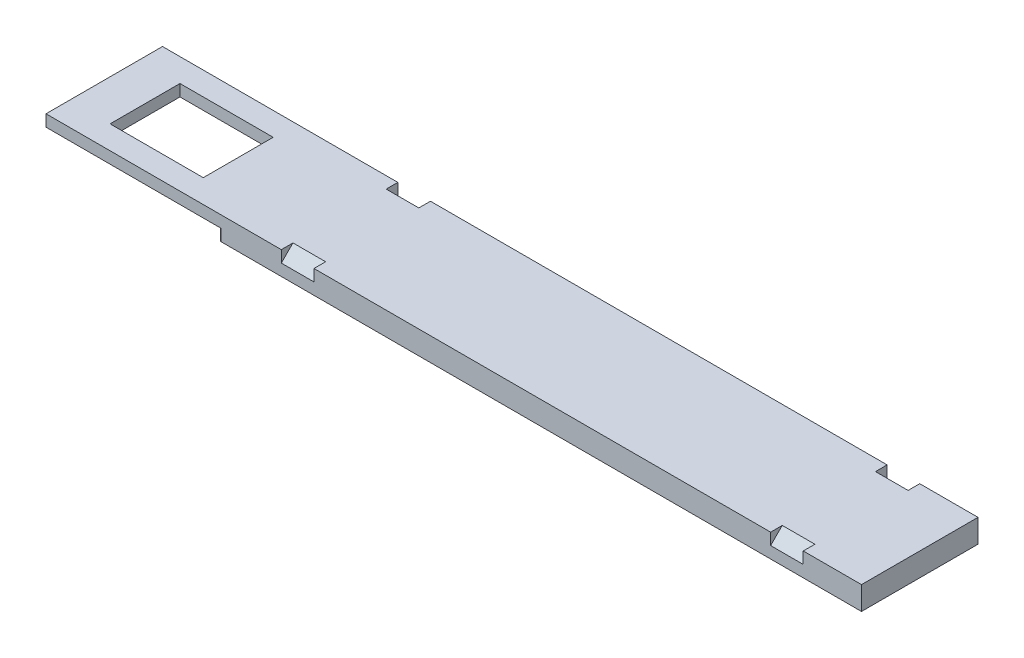
ISO-10303-21;
HEADER;
FILE_DESCRIPTION(('STEP AP214'),'2;1');
FILE_NAME('part.step','',(''),(''),'','','');
FILE_SCHEMA(('AUTOMOTIVE_DESIGN { 1 0 10303 214 1 1 1 1 }'));
ENDSEC;
DATA;
#1=APPLICATION_CONTEXT('core data for automotive mechanical design processes');
#2=APPLICATION_PROTOCOL_DEFINITION('international standard','automotive_design',2000,#1);
#3=PRODUCT_CONTEXT('',#1,'mechanical');
#4=PRODUCT('Part','Part','',(#3));
#5=PRODUCT_RELATED_PRODUCT_CATEGORY('part','',(#4));
#6=PRODUCT_DEFINITION_FORMATION('','',#4);
#7=PRODUCT_DEFINITION_CONTEXT('part definition',#1,'design');
#8=PRODUCT_DEFINITION('design','',#6,#7);
#9=PRODUCT_DEFINITION_SHAPE('','',#8);
#10=(LENGTH_UNIT() NAMED_UNIT(*) SI_UNIT(.MILLI.,.METRE.));
#11=(NAMED_UNIT(*) PLANE_ANGLE_UNIT() SI_UNIT($,.RADIAN.));
#12=(NAMED_UNIT(*) SI_UNIT($,.STERADIAN.) SOLID_ANGLE_UNIT());
#13=UNCERTAINTY_MEASURE_WITH_UNIT(LENGTH_MEASURE(1.E-05),#10,'distance_accuracy_value','');
#14=(GEOMETRIC_REPRESENTATION_CONTEXT(3) GLOBAL_UNCERTAINTY_ASSIGNED_CONTEXT((#13)) GLOBAL_UNIT_ASSIGNED_CONTEXT((#10,
#11,#12)) REPRESENTATION_CONTEXT('',''));
#15=CARTESIAN_POINT('',(0.,0.,0.));
#16=DIRECTION('',(0.,0.,1.));
#17=DIRECTION('',(1.,0.,0.));
#18=AXIS2_PLACEMENT_3D('',#15,#16,#17);
#19=CARTESIAN_POINT('',(-35.,2.,5.));
#20=DIRECTION('',(1.,0.,0.));
#21=DIRECTION('',(0.,0.,-1.));
#22=AXIS2_PLACEMENT_3D('',#19,#20,#21);
#23=PLANE('',#22);
#24=DIRECTION('',(0.,0.,-1.));
#25=VECTOR('',#24,1.);
#26=CARTESIAN_POINT('',(-35.,1.,5.));
#27=LINE('',#26,#25);
#28=CARTESIAN_POINT('',(-35.,1.,5.));
#29=VERTEX_POINT('',#28);
#30=CARTESIAN_POINT('',(-35.,1.,-5.));
#31=VERTEX_POINT('',#30);
#32=EDGE_CURVE('E238',#29,#31,#27,.T.);
#33=ORIENTED_EDGE('',*,*,#32,.F.);
#34=DIRECTION('',(0.,-1.,0.));
#35=VECTOR('',#34,1.);
#36=CARTESIAN_POINT('',(-35.,2.,5.));
#37=LINE('',#36,#35);
#38=CARTESIAN_POINT('',(-35.,2.,5.));
#39=VERTEX_POINT('',#38);
#40=EDGE_CURVE('E414',#39,#29,#37,.T.);
#41=ORIENTED_EDGE('',*,*,#40,.F.);
#42=DIRECTION('',(0.,0.,1.));
#43=VECTOR('',#42,1.);
#44=CARTESIAN_POINT('',(-35.,2.,5.));
#45=LINE('',#44,#43);
#46=CARTESIAN_POINT('',(-35.,2.,-5.));
#47=VERTEX_POINT('',#46);
#48=EDGE_CURVE('E391',#47,#39,#45,.T.);
#49=ORIENTED_EDGE('',*,*,#48,.F.);
#50=DIRECTION('',(0.,-1.,0.));
#51=VECTOR('',#50,1.);
#52=CARTESIAN_POINT('',(-35.,2.,-5.));
#53=LINE('',#52,#51);
#54=EDGE_CURVE('E48',#47,#31,#53,.T.);
#55=ORIENTED_EDGE('',*,*,#54,.T.);
#56=EDGE_LOOP('',(#33,#41,#49,#55));
#57=FACE_BOUND('',#56,.T.);
#58=ADVANCED_FACE('F39',(#57),#23,.F.);
#59=CARTESIAN_POINT('',(35.,2.,5.));
#60=DIRECTION('',(-1.,0.,0.));
#61=DIRECTION('',(0.,0.,1.));
#62=AXIS2_PLACEMENT_3D('',#59,#60,#61);
#63=PLANE('',#62);
#64=DIRECTION('',(0.,0.,-1.));
#65=VECTOR('',#64,1.);
#66=CARTESIAN_POINT('',(35.,0.,5.));
#67=LINE('',#66,#65);
#68=CARTESIAN_POINT('',(35.,0.,5.));
#69=VERTEX_POINT('',#68);
#70=CARTESIAN_POINT('',(35.,0.,-5.));
#71=VERTEX_POINT('',#70);
#72=EDGE_CURVE('E350',#69,#71,#67,.T.);
#73=ORIENTED_EDGE('',*,*,#72,.T.);
#74=DIRECTION('',(0.,-1.,0.));
#75=VECTOR('',#74,1.);
#76=CARTESIAN_POINT('',(35.,2.,-5.));
#77=LINE('',#76,#75);
#78=CARTESIAN_POINT('',(35.,2.,-5.));
#79=VERTEX_POINT('',#78);
#80=EDGE_CURVE('E11',#79,#71,#77,.T.);
#81=ORIENTED_EDGE('',*,*,#80,.F.);
#82=DIRECTION('',(0.,0.,-1.));
#83=VECTOR('',#82,1.);
#84=CARTESIAN_POINT('',(35.,2.,5.));
#85=LINE('',#84,#83);
#86=CARTESIAN_POINT('',(35.,2.,5.));
#87=VERTEX_POINT('',#86);
#88=EDGE_CURVE('E381',#87,#79,#85,.T.);
#89=ORIENTED_EDGE('',*,*,#88,.F.);
#90=DIRECTION('',(0.,-1.,0.));
#91=VECTOR('',#90,1.);
#92=CARTESIAN_POINT('',(35.,2.,5.));
#93=LINE('',#92,#91);
#94=EDGE_CURVE('E400',#87,#69,#93,.T.);
#95=ORIENTED_EDGE('',*,*,#94,.T.);
#96=EDGE_LOOP('',(#73,#81,#89,#95));
#97=FACE_BOUND('',#96,.T.);
#98=ADVANCED_FACE('F41',(#97),#63,.F.);
#99=CARTESIAN_POINT('',(-35.,2.,-5.));
#100=DIRECTION('',(0.,0.,1.));
#101=DIRECTION('',(1.,0.,0.));
#102=AXIS2_PLACEMENT_3D('',#99,#100,#101);
#103=PLANE('',#102);
#104=DIRECTION('',(-1.,0.,0.));
#105=VECTOR('',#104,1.);
#106=CARTESIAN_POINT('',(-35.,0.,-5.));
#107=LINE('',#106,#105);
#108=CARTESIAN_POINT('',(-20.,0.,-5.));
#109=VERTEX_POINT('',#108);
#110=EDGE_CURVE('E405',#71,#109,#107,.T.);
#111=ORIENTED_EDGE('',*,*,#110,.T.);
#112=DIRECTION('',(0.,-1.,0.));
#113=VECTOR('',#112,1.);
#114=CARTESIAN_POINT('',(-20.,1.,-5.));
#115=LINE('',#114,#113);
#116=CARTESIAN_POINT('',(-20.,1.,-5.));
#117=VERTEX_POINT('',#116);
#118=EDGE_CURVE('E252',#117,#109,#115,.T.);
#119=ORIENTED_EDGE('',*,*,#118,.F.);
#120=DIRECTION('',(1.,0.,0.));
#121=VECTOR('',#120,1.);
#122=CARTESIAN_POINT('',(-35.,1.,-5.));
#123=LINE('',#122,#121);
#124=EDGE_CURVE('E241',#31,#117,#123,.T.);
#125=ORIENTED_EDGE('',*,*,#124,.F.);
#126=ORIENTED_EDGE('',*,*,#54,.F.);
#127=DIRECTION('',(-1.,0.,0.));
#128=VECTOR('',#127,1.);
#129=CARTESIAN_POINT('',(-35.,2.,-5.));
#130=LINE('',#129,#128);
#131=CARTESIAN_POINT('',(-14.8,2.,-5.));
#132=VERTEX_POINT('',#131);
#133=EDGE_CURVE('E385',#132,#47,#130,.T.);
#134=ORIENTED_EDGE('',*,*,#133,.F.);
#135=DIRECTION('',(0.,1.,0.));
#136=VECTOR('',#135,1.);
#137=CARTESIAN_POINT('',(-14.8,2.,-5.));
#138=LINE('',#137,#136);
#139=CARTESIAN_POINT('',(-14.8,1.,-5.));
#140=VERTEX_POINT('',#139);
#141=EDGE_CURVE('E302',#140,#132,#138,.T.);
#142=ORIENTED_EDGE('',*,*,#141,.F.);
#143=DIRECTION('',(1.,0.,0.));
#144=VECTOR('',#143,1.);
#145=CARTESIAN_POINT('',(-14.8,1.,-5.));
#146=LINE('',#145,#144);
#147=CARTESIAN_POINT('',(-12.,1.,-5.));
#148=VERTEX_POINT('',#147);
#149=EDGE_CURVE('E279',#140,#148,#146,.T.);
#150=ORIENTED_EDGE('',*,*,#149,.T.);
#151=DIRECTION('',(0.,1.,0.));
#152=VECTOR('',#151,1.);
#153=CARTESIAN_POINT('',(-12.,2.,-5.));
#154=LINE('',#153,#152);
#155=CARTESIAN_POINT('',(-12.,2.,-5.));
#156=VERTEX_POINT('',#155);
#157=EDGE_CURVE('E298',#148,#156,#154,.T.);
#158=ORIENTED_EDGE('',*,*,#157,.T.);
#159=CARTESIAN_POINT('',(27.2,2.,-5.));
#160=VERTEX_POINT('',#159);
#161=EDGE_CURVE('E392',#160,#156,#130,.T.);
#162=ORIENTED_EDGE('',*,*,#161,.F.);
#163=DIRECTION('',(0.,1.,0.));
#164=VECTOR('',#163,1.);
#165=CARTESIAN_POINT('',(27.2,2.,-5.));
#166=LINE('',#165,#164);
#167=CARTESIAN_POINT('',(27.2,1.,-5.));
#168=VERTEX_POINT('',#167);
#169=EDGE_CURVE('E362',#168,#160,#166,.T.);
#170=ORIENTED_EDGE('',*,*,#169,.F.);
#171=DIRECTION('',(1.,0.,0.));
#172=VECTOR('',#171,1.);
#173=CARTESIAN_POINT('',(27.2,1.,-5.));
#174=LINE('',#173,#172);
#175=CARTESIAN_POINT('',(30.,1.,-5.));
#176=VERTEX_POINT('',#175);
#177=EDGE_CURVE('E339',#168,#176,#174,.T.);
#178=ORIENTED_EDGE('',*,*,#177,.T.);
#179=DIRECTION('',(0.,1.,0.));
#180=VECTOR('',#179,1.);
#181=CARTESIAN_POINT('',(30.,2.,-5.));
#182=LINE('',#181,#180);
#183=CARTESIAN_POINT('',(30.,2.,-5.));
#184=VERTEX_POINT('',#183);
#185=EDGE_CURVE('E358',#176,#184,#182,.T.);
#186=ORIENTED_EDGE('',*,*,#185,.T.);
#187=EDGE_CURVE('E387',#79,#184,#130,.T.);
#188=ORIENTED_EDGE('',*,*,#187,.F.);
#189=ORIENTED_EDGE('',*,*,#80,.T.);
#190=EDGE_LOOP('',(#111,#119,#125,#126,#134,#142,#150,#158,#162,#170,#178,#186,#188,#189));
#191=FACE_BOUND('',#190,.T.);
#192=ADVANCED_FACE('F427',(#191),#103,.F.);
#193=CARTESIAN_POINT('',(-35.,2.,5.));
#194=DIRECTION('',(0.,0.,-1.));
#195=DIRECTION('',(-1.,0.,0.));
#196=AXIS2_PLACEMENT_3D('',#193,#194,#195);
#197=PLANE('',#196);
#198=DIRECTION('',(-1.,0.,0.));
#199=VECTOR('',#198,1.);
#200=CARTESIAN_POINT('',(-35.,1.,5.));
#201=LINE('',#200,#199);
#202=CARTESIAN_POINT('',(-20.,1.,5.));
#203=VERTEX_POINT('',#202);
#204=EDGE_CURVE('E249',#203,#29,#201,.T.);
#205=ORIENTED_EDGE('',*,*,#204,.F.);
#206=DIRECTION('',(0.,-1.,0.));
#207=VECTOR('',#206,1.);
#208=CARTESIAN_POINT('',(-20.,1.,5.));
#209=LINE('',#208,#207);
#210=CARTESIAN_POINT('',(-20.,0.,5.));
#211=VERTEX_POINT('',#210);
#212=EDGE_CURVE('E255',#203,#211,#209,.T.);
#213=ORIENTED_EDGE('',*,*,#212,.T.);
#214=DIRECTION('',(1.,0.,0.));
#215=VECTOR('',#214,1.);
#216=CARTESIAN_POINT('',(-35.,0.,5.));
#217=LINE('',#216,#215);
#218=EDGE_CURVE('E386',#211,#69,#217,.T.);
#219=ORIENTED_EDGE('',*,*,#218,.T.);
#220=ORIENTED_EDGE('',*,*,#94,.F.);
#221=DIRECTION('',(1.,0.,0.));
#222=VECTOR('',#221,1.);
#223=CARTESIAN_POINT('',(-35.,2.,5.));
#224=LINE('',#223,#222);
#225=CARTESIAN_POINT('',(30.,2.,5.));
#226=VERTEX_POINT('',#225);
#227=EDGE_CURVE('E395',#226,#87,#224,.T.);
#228=ORIENTED_EDGE('',*,*,#227,.F.);
#229=DIRECTION('',(0.,-1.,0.));
#230=VECTOR('',#229,1.);
#231=CARTESIAN_POINT('',(30.,2.,5.));
#232=LINE('',#231,#230);
#233=CARTESIAN_POINT('',(30.,1.,5.));
#234=VERTEX_POINT('',#233);
#235=EDGE_CURVE('E338',#226,#234,#232,.T.);
#236=ORIENTED_EDGE('',*,*,#235,.T.);
#237=DIRECTION('',(1.,0.,0.));
#238=VECTOR('',#237,1.);
#239=CARTESIAN_POINT('',(27.2,1.,5.));
#240=LINE('',#239,#238);
#241=CARTESIAN_POINT('',(27.2,1.,5.));
#242=VERTEX_POINT('',#241);
#243=EDGE_CURVE('E333',#242,#234,#240,.T.);
#244=ORIENTED_EDGE('',*,*,#243,.F.);
#245=DIRECTION('',(0.,-1.,0.));
#246=VECTOR('',#245,1.);
#247=CARTESIAN_POINT('',(27.2,2.,5.));
#248=LINE('',#247,#246);
#249=CARTESIAN_POINT('',(27.2,2.,5.));
#250=VERTEX_POINT('',#249);
#251=EDGE_CURVE('E325',#250,#242,#248,.T.);
#252=ORIENTED_EDGE('',*,*,#251,.F.);
#253=CARTESIAN_POINT('',(-12.,2.,5.));
#254=VERTEX_POINT('',#253);
#255=EDGE_CURVE('E401',#254,#250,#224,.T.);
#256=ORIENTED_EDGE('',*,*,#255,.F.);
#257=DIRECTION('',(0.,-1.,0.));
#258=VECTOR('',#257,1.);
#259=CARTESIAN_POINT('',(-12.,2.,5.));
#260=LINE('',#259,#258);
#261=CARTESIAN_POINT('',(-12.,1.,5.));
#262=VERTEX_POINT('',#261);
#263=EDGE_CURVE('E278',#254,#262,#260,.T.);
#264=ORIENTED_EDGE('',*,*,#263,.T.);
#265=DIRECTION('',(1.,0.,0.));
#266=VECTOR('',#265,1.);
#267=CARTESIAN_POINT('',(-14.8,1.,5.));
#268=LINE('',#267,#266);
#269=CARTESIAN_POINT('',(-14.8,1.,5.));
#270=VERTEX_POINT('',#269);
#271=EDGE_CURVE('E273',#270,#262,#268,.T.);
#272=ORIENTED_EDGE('',*,*,#271,.F.);
#273=DIRECTION('',(0.,-1.,0.));
#274=VECTOR('',#273,1.);
#275=CARTESIAN_POINT('',(-14.8,2.,5.));
#276=LINE('',#275,#274);
#277=CARTESIAN_POINT('',(-14.8,2.,5.));
#278=VERTEX_POINT('',#277);
#279=EDGE_CURVE('E265',#278,#270,#276,.T.);
#280=ORIENTED_EDGE('',*,*,#279,.F.);
#281=EDGE_CURVE('E396',#39,#278,#224,.T.);
#282=ORIENTED_EDGE('',*,*,#281,.F.);
#283=ORIENTED_EDGE('',*,*,#40,.T.);
#284=EDGE_LOOP('',(#205,#213,#219,#220,#228,#236,#244,#252,#256,#264,#272,#280,#282,#283));
#285=FACE_BOUND('',#284,.T.);
#286=ADVANCED_FACE('F434',(#285),#197,.F.);
#287=CARTESIAN_POINT('',(0.,2.,0.));
#288=DIRECTION('',(0.,-1.,0.));
#289=DIRECTION('',(0.,0.,-1.));
#290=AXIS2_PLACEMENT_3D('',#287,#288,#289);
#291=PLANE('',#290);
#292=DIRECTION('',(1.,0.,0.));
#293=VECTOR('',#292,1.);
#294=CARTESIAN_POINT('',(-31.5,2.,-3.));
#295=LINE('',#294,#293);
#296=CARTESIAN_POINT('',(-31.5,2.,-3.));
#297=VERTEX_POINT('',#296);
#298=CARTESIAN_POINT('',(-23.5,2.,-3.));
#299=VERTEX_POINT('',#298);
#300=EDGE_CURVE('E198',#297,#299,#295,.T.);
#301=ORIENTED_EDGE('',*,*,#300,.T.);
#302=DIRECTION('',(0.,0.,1.));
#303=VECTOR('',#302,1.);
#304=CARTESIAN_POINT('',(-23.5,2.,3.));
#305=LINE('',#304,#303);
#306=CARTESIAN_POINT('',(-23.5,2.,3.));
#307=VERTEX_POINT('',#306);
#308=EDGE_CURVE('E191',#299,#307,#305,.T.);
#309=ORIENTED_EDGE('',*,*,#308,.T.);
#310=DIRECTION('',(-1.,0.,0.));
#311=VECTOR('',#310,1.);
#312=CARTESIAN_POINT('',(-31.5,2.,3.));
#313=LINE('',#312,#311);
#314=CARTESIAN_POINT('',(-31.5,2.,3.));
#315=VERTEX_POINT('',#314);
#316=EDGE_CURVE('E201',#307,#315,#313,.T.);
#317=ORIENTED_EDGE('',*,*,#316,.T.);
#318=DIRECTION('',(0.,0.,-1.));
#319=VECTOR('',#318,1.);
#320=CARTESIAN_POINT('',(-31.5,2.,3.));
#321=LINE('',#320,#319);
#322=EDGE_CURVE('E55',#315,#297,#321,.T.);
#323=ORIENTED_EDGE('',*,*,#322,.T.);
#324=EDGE_LOOP('',(#301,#309,#317,#323));
#325=FACE_BOUND('',#324,.T.);
#326=ORIENTED_EDGE('',*,*,#281,.T.);
#327=DIRECTION('',(0.,0.,1.));
#328=VECTOR('',#327,1.);
#329=CARTESIAN_POINT('',(-14.8,2.,5.));
#330=LINE('',#329,#328);
#331=CARTESIAN_POINT('',(-14.8,2.,4.));
#332=VERTEX_POINT('',#331);
#333=EDGE_CURVE('E262',#332,#278,#330,.T.);
#334=ORIENTED_EDGE('',*,*,#333,.F.);
#335=DIRECTION('',(1.,0.,0.));
#336=VECTOR('',#335,1.);
#337=CARTESIAN_POINT('',(-14.8,2.,4.));
#338=LINE('',#337,#336);
#339=CARTESIAN_POINT('',(-12.,2.,4.));
#340=VERTEX_POINT('',#339);
#341=EDGE_CURVE('E286',#332,#340,#338,.T.);
#342=ORIENTED_EDGE('',*,*,#341,.T.);
#343=DIRECTION('',(0.,0.,1.));
#344=VECTOR('',#343,1.);
#345=CARTESIAN_POINT('',(-12.,2.,5.));
#346=LINE('',#345,#344);
#347=EDGE_CURVE('E274',#340,#254,#346,.T.);
#348=ORIENTED_EDGE('',*,*,#347,.T.);
#349=ORIENTED_EDGE('',*,*,#255,.T.);
#350=DIRECTION('',(0.,0.,1.));
#351=VECTOR('',#350,1.);
#352=CARTESIAN_POINT('',(27.2,2.,5.));
#353=LINE('',#352,#351);
#354=CARTESIAN_POINT('',(27.2,2.,4.));
#355=VERTEX_POINT('',#354);
#356=EDGE_CURVE('E321',#355,#250,#353,.T.);
#357=ORIENTED_EDGE('',*,*,#356,.F.);
#358=DIRECTION('',(1.,0.,0.));
#359=VECTOR('',#358,1.);
#360=CARTESIAN_POINT('',(27.2,2.,4.));
#361=LINE('',#360,#359);
#362=CARTESIAN_POINT('',(30.,2.,4.));
#363=VERTEX_POINT('',#362);
#364=EDGE_CURVE('E346',#355,#363,#361,.T.);
#365=ORIENTED_EDGE('',*,*,#364,.T.);
#366=DIRECTION('',(0.,0.,1.));
#367=VECTOR('',#366,1.);
#368=CARTESIAN_POINT('',(30.,2.,5.));
#369=LINE('',#368,#367);
#370=EDGE_CURVE('E334',#363,#226,#369,.T.);
#371=ORIENTED_EDGE('',*,*,#370,.T.);
#372=ORIENTED_EDGE('',*,*,#227,.T.);
#373=ORIENTED_EDGE('',*,*,#88,.T.);
#374=ORIENTED_EDGE('',*,*,#187,.T.);
#375=DIRECTION('',(0.,0.,1.));
#376=VECTOR('',#375,1.);
#377=CARTESIAN_POINT('',(30.,2.,-4.));
#378=LINE('',#377,#376);
#379=CARTESIAN_POINT('',(30.,2.,-4.));
#380=VERTEX_POINT('',#379);
#381=EDGE_CURVE('E290',#184,#380,#378,.T.);
#382=ORIENTED_EDGE('',*,*,#381,.T.);
#383=DIRECTION('',(1.,0.,0.));
#384=VECTOR('',#383,1.);
#385=CARTESIAN_POINT('',(27.2,2.,-4.));
#386=LINE('',#385,#384);
#387=CARTESIAN_POINT('',(27.2,2.,-4.));
#388=VERTEX_POINT('',#387);
#389=EDGE_CURVE('E365',#388,#380,#386,.T.);
#390=ORIENTED_EDGE('',*,*,#389,.F.);
#391=DIRECTION('',(0.,0.,1.));
#392=VECTOR('',#391,1.);
#393=CARTESIAN_POINT('',(27.2,2.,-4.));
#394=LINE('',#393,#392);
#395=EDGE_CURVE('E353',#160,#388,#394,.T.);
#396=ORIENTED_EDGE('',*,*,#395,.F.);
#397=ORIENTED_EDGE('',*,*,#161,.T.);
#398=DIRECTION('',(0.,0.,1.));
#399=VECTOR('',#398,1.);
#400=CARTESIAN_POINT('',(-12.,2.,-4.));
#401=LINE('',#400,#399);
#402=CARTESIAN_POINT('',(-12.,2.,-4.));
#403=VERTEX_POINT('',#402);
#404=EDGE_CURVE('E259',#156,#403,#401,.T.);
#405=ORIENTED_EDGE('',*,*,#404,.T.);
#406=DIRECTION('',(1.,0.,0.));
#407=VECTOR('',#406,1.);
#408=CARTESIAN_POINT('',(-14.8,2.,-4.));
#409=LINE('',#408,#407);
#410=CARTESIAN_POINT('',(-14.8,2.,-4.));
#411=VERTEX_POINT('',#410);
#412=EDGE_CURVE('E305',#411,#403,#409,.T.);
#413=ORIENTED_EDGE('',*,*,#412,.F.);
#414=DIRECTION('',(0.,0.,1.));
#415=VECTOR('',#414,1.);
#416=CARTESIAN_POINT('',(-14.8,2.,-4.));
#417=LINE('',#416,#415);
#418=EDGE_CURVE('E293',#132,#411,#417,.T.);
#419=ORIENTED_EDGE('',*,*,#418,.F.);
#420=ORIENTED_EDGE('',*,*,#133,.T.);
#421=ORIENTED_EDGE('',*,*,#48,.T.);
#422=EDGE_LOOP('',(#326,#334,#342,#348,#349,#357,#365,#371,#372,#373,#374,#382,#390,#396,#397,
#405,#413,#419,#420,#421));
#423=FACE_BOUND('',#422,.T.);
#424=ADVANCED_FACE('F206',(#325,#423),#291,.F.);
#425=CARTESIAN_POINT('',(0.,0.,0.));
#426=DIRECTION('',(0.,-1.,0.));
#427=DIRECTION('',(0.,0.,-1.));
#428=AXIS2_PLACEMENT_3D('',#425,#426,#427);
#429=PLANE('',#428);
#430=DIRECTION('',(0.,0.,1.));
#431=VECTOR('',#430,1.);
#432=CARTESIAN_POINT('',(-20.,0.,5.));
#433=LINE('',#432,#431);
#434=EDGE_CURVE('E232',#109,#211,#433,.T.);
#435=ORIENTED_EDGE('',*,*,#434,.F.);
#436=ORIENTED_EDGE('',*,*,#110,.F.);
#437=ORIENTED_EDGE('',*,*,#72,.F.);
#438=ORIENTED_EDGE('',*,*,#218,.F.);
#439=EDGE_LOOP('',(#435,#436,#437,#438));
#440=FACE_BOUND('',#439,.T.);
#441=ADVANCED_FACE('F482',(#440),#429,.T.);
#442=CARTESIAN_POINT('',(27.2,1.,-5.));
#443=DIRECTION('',(0.,-0.707106781186547,0.707106781186547));
#444=DIRECTION('',(0.,-0.707106781186548,-0.707106781186548));
#445=AXIS2_PLACEMENT_3D('',#442,#443,#444);
#446=PLANE('',#445);
#447=DIRECTION('',(0.,-0.707106781186548,-0.707106781186548));
#448=VECTOR('',#447,1.);
#449=CARTESIAN_POINT('',(30.,1.,-5.));
#450=LINE('',#449,#448);
#451=EDGE_CURVE('E369',#380,#176,#450,.T.);
#452=ORIENTED_EDGE('',*,*,#451,.T.);
#453=ORIENTED_EDGE('',*,*,#177,.F.);
#454=DIRECTION('',(0.,-0.707106781186548,-0.707106781186548));
#455=VECTOR('',#454,1.);
#456=CARTESIAN_POINT('',(27.2,1.,-5.));
#457=LINE('',#456,#455);
#458=EDGE_CURVE('E357',#388,#168,#457,.T.);
#459=ORIENTED_EDGE('',*,*,#458,.F.);
#460=ORIENTED_EDGE('',*,*,#389,.T.);
#461=EDGE_LOOP('',(#452,#453,#459,#460));
#462=FACE_BOUND('',#461,.T.);
#463=ADVANCED_FACE('F487',(#462),#446,.F.);
#464=CARTESIAN_POINT('',(27.2,0.,0.));
#465=DIRECTION('',(-1.,0.,0.));
#466=DIRECTION('',(0.,0.,1.));
#467=AXIS2_PLACEMENT_3D('',#464,#465,#466);
#468=PLANE('',#467);
#469=ORIENTED_EDGE('',*,*,#395,.T.);
#470=ORIENTED_EDGE('',*,*,#458,.T.);
#471=ORIENTED_EDGE('',*,*,#169,.T.);
#472=EDGE_LOOP('',(#469,#470,#471));
#473=FACE_BOUND('',#472,.T.);
#474=ADVANCED_FACE('F492',(#473),#468,.F.);
#475=CARTESIAN_POINT('',(30.,0.,0.));
#476=DIRECTION('',(-1.,0.,0.));
#477=DIRECTION('',(0.,0.,1.));
#478=AXIS2_PLACEMENT_3D('',#475,#476,#477);
#479=PLANE('',#478);
#480=ORIENTED_EDGE('',*,*,#381,.F.);
#481=ORIENTED_EDGE('',*,*,#185,.F.);
#482=ORIENTED_EDGE('',*,*,#451,.F.);
#483=EDGE_LOOP('',(#480,#481,#482));
#484=FACE_BOUND('',#483,.T.);
#485=ADVANCED_FACE('F494',(#484),#479,.T.);
#486=CARTESIAN_POINT('',(27.2,2.,4.));
#487=DIRECTION('',(0.,-0.707106781186547,-0.707106781186547));
#488=DIRECTION('',(0.,0.707106781186548,-0.707106781186548));
#489=AXIS2_PLACEMENT_3D('',#486,#487,#488);
#490=PLANE('',#489);
#491=DIRECTION('',(0.,0.707106781186548,-0.707106781186548));
#492=VECTOR('',#491,1.);
#493=CARTESIAN_POINT('',(30.,2.,4.));
#494=LINE('',#493,#492);
#495=EDGE_CURVE('E326',#234,#363,#494,.T.);
#496=ORIENTED_EDGE('',*,*,#495,.T.);
#497=ORIENTED_EDGE('',*,*,#364,.F.);
#498=DIRECTION('',(0.,0.707106781186548,-0.707106781186548));
#499=VECTOR('',#498,1.);
#500=CARTESIAN_POINT('',(27.2,2.,4.));
#501=LINE('',#500,#499);
#502=EDGE_CURVE('E329',#242,#355,#501,.T.);
#503=ORIENTED_EDGE('',*,*,#502,.F.);
#504=ORIENTED_EDGE('',*,*,#243,.T.);
#505=EDGE_LOOP('',(#496,#497,#503,#504));
#506=FACE_BOUND('',#505,.T.);
#507=ADVANCED_FACE('F497',(#506),#490,.F.);
#508=CARTESIAN_POINT('',(27.2,0.,0.));
#509=DIRECTION('',(-1.,0.,0.));
#510=DIRECTION('',(0.,0.,1.));
#511=AXIS2_PLACEMENT_3D('',#508,#509,#510);
#512=PLANE('',#511);
#513=ORIENTED_EDGE('',*,*,#356,.T.);
#514=ORIENTED_EDGE('',*,*,#251,.T.);
#515=ORIENTED_EDGE('',*,*,#502,.T.);
#516=EDGE_LOOP('',(#513,#514,#515));
#517=FACE_BOUND('',#516,.T.);
#518=ADVANCED_FACE('F504',(#517),#512,.F.);
#519=CARTESIAN_POINT('',(30.,0.,0.));
#520=DIRECTION('',(-1.,0.,0.));
#521=DIRECTION('',(0.,0.,1.));
#522=AXIS2_PLACEMENT_3D('',#519,#520,#521);
#523=PLANE('',#522);
#524=ORIENTED_EDGE('',*,*,#370,.F.);
#525=ORIENTED_EDGE('',*,*,#495,.F.);
#526=ORIENTED_EDGE('',*,*,#235,.F.);
#527=EDGE_LOOP('',(#524,#525,#526));
#528=FACE_BOUND('',#527,.T.);
#529=ADVANCED_FACE('F464',(#528),#523,.T.);
#530=CARTESIAN_POINT('',(-14.8,1.,-5.));
#531=DIRECTION('',(0.,-0.707106781186547,0.707106781186547));
#532=DIRECTION('',(0.,-0.707106781186548,-0.707106781186548));
#533=AXIS2_PLACEMENT_3D('',#530,#531,#532);
#534=PLANE('',#533);
#535=DIRECTION('',(0.,-0.707106781186548,-0.707106781186548));
#536=VECTOR('',#535,1.);
#537=CARTESIAN_POINT('',(-12.,1.,-5.));
#538=LINE('',#537,#536);
#539=EDGE_CURVE('E309',#403,#148,#538,.T.);
#540=ORIENTED_EDGE('',*,*,#539,.T.);
#541=ORIENTED_EDGE('',*,*,#149,.F.);
#542=DIRECTION('',(0.,-0.707106781186548,-0.707106781186548));
#543=VECTOR('',#542,1.);
#544=CARTESIAN_POINT('',(-14.8,1.,-5.));
#545=LINE('',#544,#543);
#546=EDGE_CURVE('E297',#411,#140,#545,.T.);
#547=ORIENTED_EDGE('',*,*,#546,.F.);
#548=ORIENTED_EDGE('',*,*,#412,.T.);
#549=EDGE_LOOP('',(#540,#541,#547,#548));
#550=FACE_BOUND('',#549,.T.);
#551=ADVANCED_FACE('F453',(#550),#534,.F.);
#552=CARTESIAN_POINT('',(-14.8,0.,0.));
#553=DIRECTION('',(-1.,0.,0.));
#554=DIRECTION('',(0.,0.,1.));
#555=AXIS2_PLACEMENT_3D('',#552,#553,#554);
#556=PLANE('',#555);
#557=ORIENTED_EDGE('',*,*,#418,.T.);
#558=ORIENTED_EDGE('',*,*,#546,.T.);
#559=ORIENTED_EDGE('',*,*,#141,.T.);
#560=EDGE_LOOP('',(#557,#558,#559));
#561=FACE_BOUND('',#560,.T.);
#562=ADVANCED_FACE('F455',(#561),#556,.F.);
#563=CARTESIAN_POINT('',(-12.,0.,0.));
#564=DIRECTION('',(-1.,0.,0.));
#565=DIRECTION('',(0.,0.,1.));
#566=AXIS2_PLACEMENT_3D('',#563,#564,#565);
#567=PLANE('',#566);
#568=ORIENTED_EDGE('',*,*,#404,.F.);
#569=ORIENTED_EDGE('',*,*,#157,.F.);
#570=ORIENTED_EDGE('',*,*,#539,.F.);
#571=EDGE_LOOP('',(#568,#569,#570));
#572=FACE_BOUND('',#571,.T.);
#573=ADVANCED_FACE('F451',(#572),#567,.T.);
#574=CARTESIAN_POINT('',(-14.8,2.,4.));
#575=DIRECTION('',(0.,-0.707106781186547,-0.707106781186547));
#576=DIRECTION('',(0.,0.707106781186548,-0.707106781186548));
#577=AXIS2_PLACEMENT_3D('',#574,#575,#576);
#578=PLANE('',#577);
#579=DIRECTION('',(0.,0.707106781186548,-0.707106781186548));
#580=VECTOR('',#579,1.);
#581=CARTESIAN_POINT('',(-12.,2.,4.));
#582=LINE('',#581,#580);
#583=EDGE_CURVE('E266',#262,#340,#582,.T.);
#584=ORIENTED_EDGE('',*,*,#583,.T.);
#585=ORIENTED_EDGE('',*,*,#341,.F.);
#586=DIRECTION('',(0.,0.707106781186548,-0.707106781186548));
#587=VECTOR('',#586,1.);
#588=CARTESIAN_POINT('',(-14.8,2.,4.));
#589=LINE('',#588,#587);
#590=EDGE_CURVE('E269',#270,#332,#589,.T.);
#591=ORIENTED_EDGE('',*,*,#590,.F.);
#592=ORIENTED_EDGE('',*,*,#271,.T.);
#593=EDGE_LOOP('',(#584,#585,#591,#592));
#594=FACE_BOUND('',#593,.T.);
#595=ADVANCED_FACE('F462',(#594),#578,.F.);
#596=CARTESIAN_POINT('',(-14.8,0.,0.));
#597=DIRECTION('',(-1.,0.,0.));
#598=DIRECTION('',(0.,0.,1.));
#599=AXIS2_PLACEMENT_3D('',#596,#597,#598);
#600=PLANE('',#599);
#601=ORIENTED_EDGE('',*,*,#333,.T.);
#602=ORIENTED_EDGE('',*,*,#279,.T.);
#603=ORIENTED_EDGE('',*,*,#590,.T.);
#604=EDGE_LOOP('',(#601,#602,#603));
#605=FACE_BOUND('',#604,.T.);
#606=ADVANCED_FACE('F530',(#605),#600,.F.);
#607=CARTESIAN_POINT('',(-12.,0.,0.));
#608=DIRECTION('',(-1.,0.,0.));
#609=DIRECTION('',(0.,0.,1.));
#610=AXIS2_PLACEMENT_3D('',#607,#608,#609);
#611=PLANE('',#610);
#612=ORIENTED_EDGE('',*,*,#347,.F.);
#613=ORIENTED_EDGE('',*,*,#583,.F.);
#614=ORIENTED_EDGE('',*,*,#263,.F.);
#615=EDGE_LOOP('',(#612,#613,#614));
#616=FACE_BOUND('',#615,.T.);
#617=ADVANCED_FACE('F526',(#616),#611,.T.);
#618=CARTESIAN_POINT('',(-20.,1.,5.));
#619=DIRECTION('',(1.,0.,0.));
#620=DIRECTION('',(0.,0.,-1.));
#621=AXIS2_PLACEMENT_3D('',#618,#619,#620);
#622=PLANE('',#621);
#623=ORIENTED_EDGE('',*,*,#434,.T.);
#624=ORIENTED_EDGE('',*,*,#212,.F.);
#625=DIRECTION('',(0.,0.,1.));
#626=VECTOR('',#625,1.);
#627=CARTESIAN_POINT('',(-20.,1.,5.));
#628=LINE('',#627,#626);
#629=EDGE_CURVE('E245',#117,#203,#628,.T.);
#630=ORIENTED_EDGE('',*,*,#629,.F.);
#631=ORIENTED_EDGE('',*,*,#118,.T.);
#632=EDGE_LOOP('',(#623,#624,#630,#631));
#633=FACE_BOUND('',#632,.T.);
#634=ADVANCED_FACE('F537',(#633),#622,.F.);
#635=CARTESIAN_POINT('',(0.,1.,0.));
#636=DIRECTION('',(0.,-1.,0.));
#637=DIRECTION('',(0.,0.,-1.));
#638=AXIS2_PLACEMENT_3D('',#635,#636,#637);
#639=PLANE('',#638);
#640=DIRECTION('',(0.,0.,1.));
#641=VECTOR('',#640,1.);
#642=CARTESIAN_POINT('',(-23.5,1.,3.));
#643=LINE('',#642,#641);
#644=CARTESIAN_POINT('',(-23.5,1.,-3.));
#645=VERTEX_POINT('',#644);
#646=CARTESIAN_POINT('',(-23.5,1.,3.));
#647=VERTEX_POINT('',#646);
#648=EDGE_CURVE('E63',#645,#647,#643,.T.);
#649=ORIENTED_EDGE('',*,*,#648,.F.);
#650=DIRECTION('',(1.,0.,0.));
#651=VECTOR('',#650,1.);
#652=CARTESIAN_POINT('',(-31.5,1.,-3.));
#653=LINE('',#652,#651);
#654=CARTESIAN_POINT('',(-31.5,1.,-3.));
#655=VERTEX_POINT('',#654);
#656=EDGE_CURVE('E210',#655,#645,#653,.T.);
#657=ORIENTED_EDGE('',*,*,#656,.F.);
#658=DIRECTION('',(0.,0.,-1.));
#659=VECTOR('',#658,1.);
#660=CARTESIAN_POINT('',(-31.5,1.,3.));
#661=LINE('',#660,#659);
#662=CARTESIAN_POINT('',(-31.5,1.,3.));
#663=VERTEX_POINT('',#662);
#664=EDGE_CURVE('E214',#663,#655,#661,.T.);
#665=ORIENTED_EDGE('',*,*,#664,.F.);
#666=DIRECTION('',(-1.,0.,0.));
#667=VECTOR('',#666,1.);
#668=CARTESIAN_POINT('',(-31.5,1.,3.));
#669=LINE('',#668,#667);
#670=EDGE_CURVE('E223',#647,#663,#669,.T.);
#671=ORIENTED_EDGE('',*,*,#670,.F.);
#672=EDGE_LOOP('',(#649,#657,#665,#671));
#673=FACE_BOUND('',#672,.T.);
#674=ORIENTED_EDGE('',*,*,#32,.T.);
#675=ORIENTED_EDGE('',*,*,#124,.T.);
#676=ORIENTED_EDGE('',*,*,#629,.T.);
#677=ORIENTED_EDGE('',*,*,#204,.T.);
#678=EDGE_LOOP('',(#674,#675,#676,#677));
#679=FACE_BOUND('',#678,.T.);
#680=ADVANCED_FACE('F431',(#673,#679),#639,.T.);
#681=CARTESIAN_POINT('',(-23.5,2.,3.));
#682=DIRECTION('',(1.,0.,0.));
#683=DIRECTION('',(0.,0.,-1.));
#684=AXIS2_PLACEMENT_3D('',#681,#682,#683);
#685=PLANE('',#684);
#686=ORIENTED_EDGE('',*,*,#648,.T.);
#687=DIRECTION('',(0.,-1.,0.));
#688=VECTOR('',#687,1.);
#689=CARTESIAN_POINT('',(-23.5,2.,3.));
#690=LINE('',#689,#688);
#691=EDGE_CURVE('E187',#307,#647,#690,.T.);
#692=ORIENTED_EDGE('',*,*,#691,.F.);
#693=ORIENTED_EDGE('',*,*,#308,.F.);
#694=DIRECTION('',(0.,-1.,0.));
#695=VECTOR('',#694,1.);
#696=CARTESIAN_POINT('',(-23.5,2.,-3.));
#697=LINE('',#696,#695);
#698=EDGE_CURVE('E229',#299,#645,#697,.T.);
#699=ORIENTED_EDGE('',*,*,#698,.T.);
#700=EDGE_LOOP('',(#686,#692,#693,#699));
#701=FACE_BOUND('',#700,.T.);
#702=ADVANCED_FACE('F189',(#701),#685,.F.);
#703=CARTESIAN_POINT('',(-31.5,2.,-3.));
#704=DIRECTION('',(0.,0.,-1.));
#705=DIRECTION('',(-1.,0.,0.));
#706=AXIS2_PLACEMENT_3D('',#703,#704,#705);
#707=PLANE('',#706);
#708=ORIENTED_EDGE('',*,*,#656,.T.);
#709=ORIENTED_EDGE('',*,*,#698,.F.);
#710=ORIENTED_EDGE('',*,*,#300,.F.);
#711=DIRECTION('',(0.,-1.,0.));
#712=VECTOR('',#711,1.);
#713=CARTESIAN_POINT('',(-31.5,2.,-3.));
#714=LINE('',#713,#712);
#715=EDGE_CURVE('E233',#297,#655,#714,.T.);
#716=ORIENTED_EDGE('',*,*,#715,.T.);
#717=EDGE_LOOP('',(#708,#709,#710,#716));
#718=FACE_BOUND('',#717,.T.);
#719=ADVANCED_FACE('F548',(#718),#707,.F.);
#720=CARTESIAN_POINT('',(-31.5,2.,3.));
#721=DIRECTION('',(-1.,0.,0.));
#722=DIRECTION('',(0.,0.,1.));
#723=AXIS2_PLACEMENT_3D('',#720,#721,#722);
#724=PLANE('',#723);
#725=ORIENTED_EDGE('',*,*,#664,.T.);
#726=ORIENTED_EDGE('',*,*,#715,.F.);
#727=ORIENTED_EDGE('',*,*,#322,.F.);
#728=DIRECTION('',(0.,-1.,0.));
#729=VECTOR('',#728,1.);
#730=CARTESIAN_POINT('',(-31.5,2.,3.));
#731=LINE('',#730,#729);
#732=EDGE_CURVE('E197',#315,#663,#731,.T.);
#733=ORIENTED_EDGE('',*,*,#732,.T.);
#734=EDGE_LOOP('',(#725,#726,#727,#733));
#735=FACE_BOUND('',#734,.T.);
#736=ADVANCED_FACE('F551',(#735),#724,.F.);
#737=CARTESIAN_POINT('',(-31.5,2.,3.));
#738=DIRECTION('',(0.,0.,1.));
#739=DIRECTION('',(1.,0.,0.));
#740=AXIS2_PLACEMENT_3D('',#737,#738,#739);
#741=PLANE('',#740);
#742=ORIENTED_EDGE('',*,*,#670,.T.);
#743=ORIENTED_EDGE('',*,*,#732,.F.);
#744=ORIENTED_EDGE('',*,*,#316,.F.);
#745=ORIENTED_EDGE('',*,*,#691,.T.);
#746=EDGE_LOOP('',(#742,#743,#744,#745));
#747=FACE_BOUND('',#746,.T.);
#748=ADVANCED_FACE('F202',(#747),#741,.F.);
#749=CLOSED_SHELL('',(#58,#98,#192,#286,#424,#441,#463,#474,#485,#507,#518,#529,#551,#562,#573,
#595,#606,#617,#634,#680,#702,#719,#736,#748));
#750=MANIFOLD_SOLID_BREP('B2',#749);
#751=ADVANCED_BREP_SHAPE_REPRESENTATION('',(#18,#750),#14);
#752=SHAPE_DEFINITION_REPRESENTATION(#9,#751);
ENDSEC;
END-ISO-10303-21;
